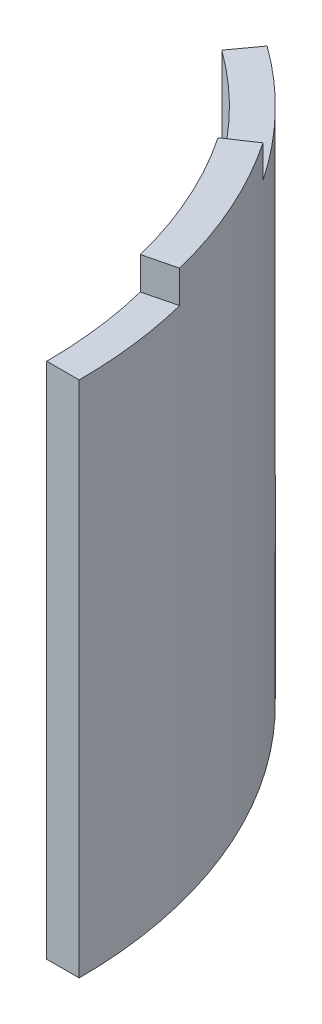
ISO-10303-21;
HEADER;
FILE_DESCRIPTION(('STEP AP214'),'2;1');
FILE_NAME('part.step','',(''),(''),'','','');
FILE_SCHEMA(('AUTOMOTIVE_DESIGN { 1 0 10303 214 1 1 1 1 }'));
ENDSEC;
DATA;
#1=APPLICATION_CONTEXT('core data for automotive mechanical design processes');
#2=APPLICATION_PROTOCOL_DEFINITION('international standard','automotive_design',2000,#1);
#3=PRODUCT_CONTEXT('',#1,'mechanical');
#4=PRODUCT('Part','Part','',(#3));
#5=PRODUCT_RELATED_PRODUCT_CATEGORY('part','',(#4));
#6=PRODUCT_DEFINITION_FORMATION('','',#4);
#7=PRODUCT_DEFINITION_CONTEXT('part definition',#1,'design');
#8=PRODUCT_DEFINITION('design','',#6,#7);
#9=PRODUCT_DEFINITION_SHAPE('','',#8);
#10=(LENGTH_UNIT() NAMED_UNIT(*) SI_UNIT(.MILLI.,.METRE.));
#11=(NAMED_UNIT(*) PLANE_ANGLE_UNIT() SI_UNIT($,.RADIAN.));
#12=(NAMED_UNIT(*) SI_UNIT($,.STERADIAN.) SOLID_ANGLE_UNIT());
#13=UNCERTAINTY_MEASURE_WITH_UNIT(LENGTH_MEASURE(1.E-05),#10,'distance_accuracy_value','');
#14=(GEOMETRIC_REPRESENTATION_CONTEXT(3) GLOBAL_UNCERTAINTY_ASSIGNED_CONTEXT((#13)) GLOBAL_UNIT_ASSIGNED_CONTEXT((#10,
#11,#12)) REPRESENTATION_CONTEXT('',''));
#15=CARTESIAN_POINT('',(0.,0.,0.));
#16=DIRECTION('',(0.,0.,1.));
#17=DIRECTION('',(1.,0.,0.));
#18=AXIS2_PLACEMENT_3D('',#15,#16,#17);
#19=CARTESIAN_POINT('',(0.,25.3500001,0.));
#20=DIRECTION('',(0.,1.,0.));
#21=DIRECTION('',(0.,0.,1.));
#22=AXIS2_PLACEMENT_3D('',#19,#20,#21);
#23=PLANE('',#22);
#24=DIRECTION('',(0.970295726275994,0.,-0.241921895599678));
#25=VECTOR('',#24,1.);
#26=CARTESIAN_POINT('',(41.8973694605974,25.3500001,-10.4461874519941));
#27=LINE('',#26,#25);
#28=CARTESIAN_POINT('',(41.8973694605974,25.3500001,-10.4461874519941));
#29=VERTEX_POINT('',#28);
#30=CARTESIAN_POINT('',(44.9780583915237,25.3500001,-11.2142894705231));
#31=VERTEX_POINT('',#30);
#32=EDGE_CURVE('E126',#29,#31,#27,.T.);
#33=ORIENTED_EDGE('',*,*,#32,.F.);
#34=CARTESIAN_POINT('',(0.,25.3500001,0.));
#35=DIRECTION('',(0.,-1.,0.));
#36=DIRECTION('',(0.,0.,1.));
#37=AXIS2_PLACEMENT_3D('',#34,#35,#36);
#38=CIRCLE('',#37,43.18);
#39=CARTESIAN_POINT('',(43.18,25.3500001,0.));
#40=VERTEX_POINT('',#39);
#41=EDGE_CURVE('E147',#29,#40,#38,.T.);
#42=ORIENTED_EDGE('',*,*,#41,.T.);
#43=DIRECTION('',(1.,0.,0.));
#44=VECTOR('',#43,1.);
#45=CARTESIAN_POINT('',(43.18,25.3500001,0.));
#46=LINE('',#45,#44);
#47=CARTESIAN_POINT('',(46.355,25.3500001,0.));
#48=VERTEX_POINT('',#47);
#49=EDGE_CURVE('E146',#40,#48,#46,.T.);
#50=ORIENTED_EDGE('',*,*,#49,.T.);
#51=CARTESIAN_POINT('',(0.,25.3500001,0.));
#52=DIRECTION('',(0.,1.,0.));
#53=DIRECTION('',(0.,0.,1.));
#54=AXIS2_PLACEMENT_3D('',#51,#52,#53);
#55=CIRCLE('',#54,46.355);
#56=EDGE_CURVE('E63',#48,#31,#55,.T.);
#57=ORIENTED_EDGE('',*,*,#56,.T.);
#58=EDGE_LOOP('',(#33,#42,#50,#57));
#59=FACE_BOUND('',#58,.T.);
#60=ADVANCED_FACE('F39',(#59),#23,.T.);
#61=CARTESIAN_POINT('',(0.,25.3500001,0.));
#62=DIRECTION('',(0.,-1.,0.));
#63=DIRECTION('',(0.,0.,-1.));
#64=AXIS2_PLACEMENT_3D('',#61,#62,#63);
#65=CYLINDRICAL_SURFACE('',#64,43.18);
#66=CARTESIAN_POINT('',(0.,-25.3500001,0.));
#67=DIRECTION('',(0.,-1.,0.));
#68=DIRECTION('',(0.,0.,1.));
#69=AXIS2_PLACEMENT_3D('',#66,#67,#68);
#70=CIRCLE('',#69,43.18);
#71=CARTESIAN_POINT('',(25.3805671939889,-25.3500001,-34.9333538171103));
#72=VERTEX_POINT('',#71);
#73=CARTESIAN_POINT('',(43.18,-25.3500001,0.));
#74=VERTEX_POINT('',#73);
#75=EDGE_CURVE('E132',#72,#74,#70,.T.);
#76=ORIENTED_EDGE('',*,*,#75,.T.);
#77=DIRECTION('',(0.,-1.,0.));
#78=VECTOR('',#77,1.);
#79=CARTESIAN_POINT('',(43.18,25.3500001,0.));
#80=LINE('',#79,#78);
#81=EDGE_CURVE('E11',#40,#74,#80,.T.);
#82=ORIENTED_EDGE('',*,*,#81,.F.);
#83=ORIENTED_EDGE('',*,*,#41,.F.);
#84=DIRECTION('',(0.,-1.,0.));
#85=VECTOR('',#84,1.);
#86=CARTESIAN_POINT('',(41.8973694605974,28.5250001,-10.4461874519941));
#87=LINE('',#86,#85);
#88=CARTESIAN_POINT('',(41.8973694605974,28.5250001,-10.4461874519941));
#89=VERTEX_POINT('',#88);
#90=EDGE_CURVE('E139',#89,#29,#87,.T.);
#91=ORIENTED_EDGE('',*,*,#90,.F.);
#92=CARTESIAN_POINT('',(0.,28.5250001,0.));
#93=DIRECTION('',(0.,-1.,0.));
#94=DIRECTION('',(0.,0.,1.));
#95=AXIS2_PLACEMENT_3D('',#92,#93,#94);
#96=CIRCLE('',#95,43.18);
#97=CARTESIAN_POINT('',(35.7978423829264,28.5250001,-24.1459495718672));
#98=VERTEX_POINT('',#97);
#99=EDGE_CURVE('E115',#98,#89,#96,.T.);
#100=ORIENTED_EDGE('',*,*,#99,.F.);
#101=DIRECTION('',(0.,-1.,0.));
#102=VECTOR('',#101,1.);
#103=CARTESIAN_POINT('',(35.7978423829264,28.5250001,-24.1459495718672));
#104=LINE('',#103,#102);
#105=CARTESIAN_POINT('',(35.7978423829264,25.3500001,-24.1459495718672));
#106=VERTEX_POINT('',#105);
#107=EDGE_CURVE('E111',#98,#106,#104,.T.);
#108=ORIENTED_EDGE('',*,*,#107,.T.);
#109=CARTESIAN_POINT('',(25.3805671939889,25.3500001,-34.9333538171103));
#110=VERTEX_POINT('',#109);
#111=EDGE_CURVE('E143',#110,#106,#38,.T.);
#112=ORIENTED_EDGE('',*,*,#111,.F.);
#113=DIRECTION('',(0.,-1.,0.));
#114=VECTOR('',#113,1.);
#115=CARTESIAN_POINT('',(25.3805671939889,25.3500001,-34.9333538171103));
#116=LINE('',#115,#114);
#117=EDGE_CURVE('E154',#110,#72,#116,.T.);
#118=ORIENTED_EDGE('',*,*,#117,.T.);
#119=EDGE_LOOP('',(#76,#82,#83,#91,#100,#108,#112,#118));
#120=FACE_BOUND('',#119,.T.);
#121=ADVANCED_FACE('F41',(#120),#65,.F.);
#122=CARTESIAN_POINT('',(43.18,25.3500001,0.));
#123=DIRECTION('',(0.,0.,-1.));
#124=DIRECTION('',(-1.,0.,0.));
#125=AXIS2_PLACEMENT_3D('',#122,#123,#124);
#126=PLANE('',#125);
#127=DIRECTION('',(1.,0.,0.));
#128=VECTOR('',#127,1.);
#129=CARTESIAN_POINT('',(43.18,-25.3500001,0.));
#130=LINE('',#129,#128);
#131=CARTESIAN_POINT('',(46.355,-25.3500001,0.));
#132=VERTEX_POINT('',#131);
#133=EDGE_CURVE('E137',#74,#132,#130,.T.);
#134=ORIENTED_EDGE('',*,*,#133,.T.);
#135=DIRECTION('',(0.,-1.,0.));
#136=VECTOR('',#135,1.);
#137=CARTESIAN_POINT('',(46.355,25.3500001,0.));
#138=LINE('',#137,#136);
#139=EDGE_CURVE('E48',#48,#132,#138,.T.);
#140=ORIENTED_EDGE('',*,*,#139,.F.);
#141=ORIENTED_EDGE('',*,*,#49,.F.);
#142=ORIENTED_EDGE('',*,*,#81,.T.);
#143=EDGE_LOOP('',(#134,#140,#141,#142));
#144=FACE_BOUND('',#143,.T.);
#145=ADVANCED_FACE('F205',(#144),#126,.F.);
#146=CARTESIAN_POINT('',(0.,25.3500001,0.));
#147=DIRECTION('',(0.,-1.,0.));
#148=DIRECTION('',(0.,0.,-1.));
#149=AXIS2_PLACEMENT_3D('',#146,#147,#148);
#150=CYLINDRICAL_SURFACE('',#149,46.355);
#151=CARTESIAN_POINT('',(0.,-25.3500001,0.));
#152=DIRECTION('',(0.,1.,0.));
#153=DIRECTION('',(0.,0.,1.));
#154=AXIS2_PLACEMENT_3D('',#151,#152,#153);
#155=CIRCLE('',#154,46.355);
#156=CARTESIAN_POINT('',(27.2467853700175,-25.3500001,-37.5019827742507));
#157=VERTEX_POINT('',#156);
#158=EDGE_CURVE('E158',#132,#157,#155,.T.);
#159=ORIENTED_EDGE('',*,*,#158,.T.);
#160=DIRECTION('',(0.,-1.,0.));
#161=VECTOR('',#160,1.);
#162=CARTESIAN_POINT('',(27.2467853700175,25.3500001,-37.5019827742507));
#163=LINE('',#162,#161);
#164=CARTESIAN_POINT('',(27.2467853700175,25.3500001,-37.5019827742507));
#165=VERTEX_POINT('',#164);
#166=EDGE_CURVE('E167',#165,#157,#163,.T.);
#167=ORIENTED_EDGE('',*,*,#166,.F.);
#168=CARTESIAN_POINT('',(38.4300366757887,25.3500001,-25.9213870403869));
#169=VERTEX_POINT('',#168);
#170=EDGE_CURVE('E130',#169,#165,#55,.T.);
#171=ORIENTED_EDGE('',*,*,#170,.F.);
#172=DIRECTION('',(0.,-1.,0.));
#173=VECTOR('',#172,1.);
#174=CARTESIAN_POINT('',(38.4300366757887,28.5250001,-25.9213870403869));
#175=LINE('',#174,#173);
#176=CARTESIAN_POINT('',(38.4300366757887,28.5250001,-25.9213870403869));
#177=VERTEX_POINT('',#176);
#178=EDGE_CURVE('E109',#177,#169,#175,.T.);
#179=ORIENTED_EDGE('',*,*,#178,.F.);
#180=CARTESIAN_POINT('',(0.,28.5250001,0.));
#181=DIRECTION('',(0.,1.,0.));
#182=DIRECTION('',(0.,0.,-1.));
#183=AXIS2_PLACEMENT_3D('',#180,#181,#182);
#184=CIRCLE('',#183,46.355);
#185=CARTESIAN_POINT('',(44.9780583915237,28.5250001,-11.2142894705231));
#186=VERTEX_POINT('',#185);
#187=EDGE_CURVE('E116',#186,#177,#184,.T.);
#188=ORIENTED_EDGE('',*,*,#187,.F.);
#189=DIRECTION('',(0.,-1.,0.));
#190=VECTOR('',#189,1.);
#191=CARTESIAN_POINT('',(44.9780583915237,28.5250001,-11.2142894705231));
#192=LINE('',#191,#190);
#193=EDGE_CURVE('E195',#186,#31,#192,.T.);
#194=ORIENTED_EDGE('',*,*,#193,.T.);
#195=ORIENTED_EDGE('',*,*,#56,.F.);
#196=ORIENTED_EDGE('',*,*,#139,.T.);
#197=EDGE_LOOP('',(#159,#167,#171,#179,#188,#194,#195,#196));
#198=FACE_BOUND('',#197,.T.);
#199=ADVANCED_FACE('F128',(#198),#150,.T.);
#200=CARTESIAN_POINT('',(25.3805671939889,25.3500001,-34.9333538171103));
#201=DIRECTION('',(0.809016994374948,0.,0.587785252292472));
#202=DIRECTION('',(0.587785252292472,0.,-0.809016994374948));
#203=AXIS2_PLACEMENT_3D('',#200,#201,#202);
#204=PLANE('',#203);
#205=DIRECTION('',(-0.587785252292472,0.,0.809016994374949));
#206=VECTOR('',#205,1.);
#207=CARTESIAN_POINT('',(25.3805671939889,-25.3500001,-34.9333538171103));
#208=LINE('',#207,#206);
#209=EDGE_CURVE('E161',#157,#72,#208,.T.);
#210=ORIENTED_EDGE('',*,*,#209,.T.);
#211=ORIENTED_EDGE('',*,*,#117,.F.);
#212=DIRECTION('',(-0.587785252292472,0.,0.809016994374949));
#213=VECTOR('',#212,1.);
#214=CARTESIAN_POINT('',(25.3805671939889,25.3500001,-34.9333538171103));
#215=LINE('',#214,#213);
#216=EDGE_CURVE('E152',#165,#110,#215,.T.);
#217=ORIENTED_EDGE('',*,*,#216,.F.);
#218=ORIENTED_EDGE('',*,*,#166,.T.);
#219=EDGE_LOOP('',(#210,#211,#217,#218));
#220=FACE_BOUND('',#219,.T.);
#221=ADVANCED_FACE('F182',(#220),#204,.F.);
#222=DIRECTION('',(-0.829037572555035,0.,0.559192903470756));
#223=VECTOR('',#222,1.);
#224=CARTESIAN_POINT('',(35.7978423829264,25.3500001,-24.1459495718672));
#225=LINE('',#224,#223);
#226=EDGE_CURVE('E55',#169,#106,#225,.T.);
#227=ORIENTED_EDGE('',*,*,#226,.F.);
#228=ORIENTED_EDGE('',*,*,#170,.T.);
#229=ORIENTED_EDGE('',*,*,#216,.T.);
#230=ORIENTED_EDGE('',*,*,#111,.T.);
#231=EDGE_LOOP('',(#227,#228,#229,#230));
#232=FACE_BOUND('',#231,.T.);
#233=ADVANCED_FACE('F187',(#232),#23,.T.);
#234=CARTESIAN_POINT('',(0.,-25.3500001,0.));
#235=DIRECTION('',(0.,1.,0.));
#236=DIRECTION('',(0.,0.,1.));
#237=AXIS2_PLACEMENT_3D('',#234,#235,#236);
#238=PLANE('',#237);
#239=ORIENTED_EDGE('',*,*,#75,.F.);
#240=ORIENTED_EDGE('',*,*,#209,.F.);
#241=ORIENTED_EDGE('',*,*,#158,.F.);
#242=ORIENTED_EDGE('',*,*,#133,.F.);
#243=EDGE_LOOP('',(#239,#240,#241,#242));
#244=FACE_BOUND('',#243,.T.);
#245=ADVANCED_FACE('F179',(#244),#238,.F.);
#246=CARTESIAN_POINT('',(35.7978423829264,28.5250001,-24.1459495718672));
#247=DIRECTION('',(0.559192903470756,0.,0.829037572555035));
#248=DIRECTION('',(0.829037572555035,0.,-0.559192903470756));
#249=AXIS2_PLACEMENT_3D('',#246,#247,#248);
#250=PLANE('',#249);
#251=ORIENTED_EDGE('',*,*,#226,.T.);
#252=ORIENTED_EDGE('',*,*,#107,.F.);
#253=DIRECTION('',(-0.829037572555035,0.,0.559192903470756));
#254=VECTOR('',#253,1.);
#255=CARTESIAN_POINT('',(35.7978423829264,28.5250001,-24.1459495718672));
#256=LINE('',#255,#254);
#257=EDGE_CURVE('E105',#177,#98,#256,.T.);
#258=ORIENTED_EDGE('',*,*,#257,.F.);
#259=ORIENTED_EDGE('',*,*,#178,.T.);
#260=EDGE_LOOP('',(#251,#252,#258,#259));
#261=FACE_BOUND('',#260,.T.);
#262=ADVANCED_FACE('F107',(#261),#250,.F.);
#263=CARTESIAN_POINT('',(41.8973694605974,28.5250001,-10.4461874519941));
#264=DIRECTION('',(-0.241921895599678,0.,-0.970295726275994));
#265=DIRECTION('',(-0.970295726275994,0.,0.241921895599678));
#266=AXIS2_PLACEMENT_3D('',#263,#264,#265);
#267=PLANE('',#266);
#268=ORIENTED_EDGE('',*,*,#32,.T.);
#269=ORIENTED_EDGE('',*,*,#193,.F.);
#270=DIRECTION('',(0.970295726275994,0.,-0.241921895599678));
#271=VECTOR('',#270,1.);
#272=CARTESIAN_POINT('',(41.8973694605974,28.5250001,-10.4461874519941));
#273=LINE('',#272,#271);
#274=EDGE_CURVE('E121',#89,#186,#273,.T.);
#275=ORIENTED_EDGE('',*,*,#274,.F.);
#276=ORIENTED_EDGE('',*,*,#90,.T.);
#277=EDGE_LOOP('',(#268,#269,#275,#276));
#278=FACE_BOUND('',#277,.T.);
#279=ADVANCED_FACE('F201',(#278),#267,.F.);
#280=CARTESIAN_POINT('',(0.,28.5250001,0.));
#281=DIRECTION('',(0.,-1.,0.));
#282=DIRECTION('',(0.,0.,-1.));
#283=AXIS2_PLACEMENT_3D('',#280,#281,#282);
#284=PLANE('',#283);
#285=ORIENTED_EDGE('',*,*,#187,.T.);
#286=ORIENTED_EDGE('',*,*,#257,.T.);
#287=ORIENTED_EDGE('',*,*,#99,.T.);
#288=ORIENTED_EDGE('',*,*,#274,.T.);
#289=EDGE_LOOP('',(#285,#286,#287,#288));
#290=FACE_BOUND('',#289,.T.);
#291=ADVANCED_FACE('F119',(#290),#284,.F.);
#292=CLOSED_SHELL('',(#60,#121,#145,#199,#221,#233,#245,#262,#279,#291));
#293=MANIFOLD_SOLID_BREP('B2',#292);
#294=ADVANCED_BREP_SHAPE_REPRESENTATION('',(#18,#293),#14);
#295=SHAPE_DEFINITION_REPRESENTATION(#9,#294);
ENDSEC;
END-ISO-10303-21;
